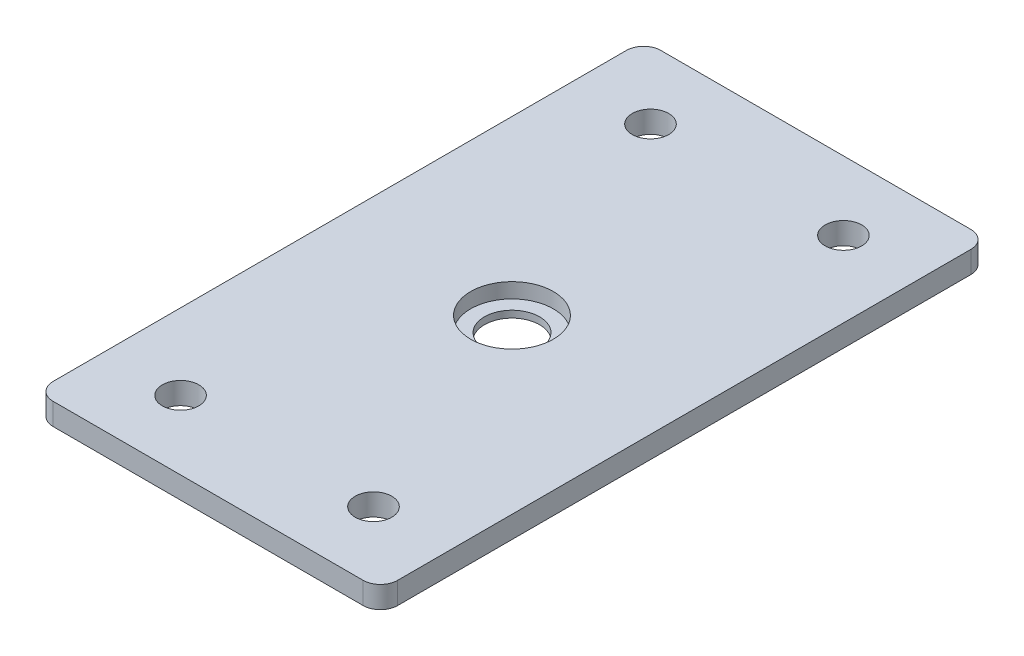
ISO-10303-21;
HEADER;
FILE_DESCRIPTION(('STEP AP214'),'2;1');
FILE_NAME('part.step','',(''),(''),'','','');
FILE_SCHEMA(('AUTOMOTIVE_DESIGN { 1 0 10303 214 1 1 1 1 }'));
ENDSEC;
DATA;
#1=APPLICATION_CONTEXT('core data for automotive mechanical design processes');
#2=APPLICATION_PROTOCOL_DEFINITION('international standard','automotive_design',2000,#1);
#3=PRODUCT_CONTEXT('',#1,'mechanical');
#4=PRODUCT('Part','Part','',(#3));
#5=PRODUCT_RELATED_PRODUCT_CATEGORY('part','',(#4));
#6=PRODUCT_DEFINITION_FORMATION('','',#4);
#7=PRODUCT_DEFINITION_CONTEXT('part definition',#1,'design');
#8=PRODUCT_DEFINITION('design','',#6,#7);
#9=PRODUCT_DEFINITION_SHAPE('','',#8);
#10=(LENGTH_UNIT() NAMED_UNIT(*) SI_UNIT(.MILLI.,.METRE.));
#11=(NAMED_UNIT(*) PLANE_ANGLE_UNIT() SI_UNIT($,.RADIAN.));
#12=(NAMED_UNIT(*) SI_UNIT($,.STERADIAN.) SOLID_ANGLE_UNIT());
#13=UNCERTAINTY_MEASURE_WITH_UNIT(LENGTH_MEASURE(1.E-05),#10,'distance_accuracy_value','');
#14=(GEOMETRIC_REPRESENTATION_CONTEXT(3) GLOBAL_UNCERTAINTY_ASSIGNED_CONTEXT((#13)) GLOBAL_UNIT_ASSIGNED_CONTEXT((#10,
#11,#12)) REPRESENTATION_CONTEXT('',''));
#15=CARTESIAN_POINT('',(0.,0.,0.));
#16=DIRECTION('',(0.,0.,1.));
#17=DIRECTION('',(1.,0.,0.));
#18=AXIS2_PLACEMENT_3D('',#15,#16,#17);
#19=CARTESIAN_POINT('',(0.,-43.85,0.));
#20=DIRECTION('',(0.,1.,0.));
#21=DIRECTION('',(0.,0.,1.));
#22=AXIS2_PLACEMENT_3D('',#19,#20,#21);
#23=CYLINDRICAL_SURFACE('',#22,4.);
#24=CARTESIAN_POINT('',(0.,-43.85,0.));
#25=DIRECTION('',(0.,1.,0.));
#26=DIRECTION('',(0.,0.,1.));
#27=AXIS2_PLACEMENT_3D('',#24,#25,#26);
#28=CIRCLE('',#27,4.);
#29=CARTESIAN_POINT('',(0.,-43.85,4.));
#30=VERTEX_POINT('',#29);
#31=EDGE_CURVE('E148',#30,#30,#28,.T.);
#32=ORIENTED_EDGE('',*,*,#31,.F.);
#33=EDGE_LOOP('',(#32));
#34=FACE_BOUND('',#33,.T.);
#35=CARTESIAN_POINT('',(0.,-42.85,0.));
#36=DIRECTION('',(0.,1.,0.));
#37=DIRECTION('',(0.,0.,1.));
#38=AXIS2_PLACEMENT_3D('',#35,#36,#37);
#39=CIRCLE('',#38,4.);
#40=CARTESIAN_POINT('',(0.,-42.85,4.));
#41=VERTEX_POINT('',#40);
#42=EDGE_CURVE('E317',#41,#41,#39,.T.);
#43=ORIENTED_EDGE('',*,*,#42,.T.);
#44=EDGE_LOOP('',(#43));
#45=FACE_BOUND('',#44,.T.);
#46=ADVANCED_FACE('F41',(#34,#45),#23,.F.);
#47=CARTESIAN_POINT('',(0.,-43.85,-44.1));
#48=DIRECTION('',(0.,0.,1.));
#49=DIRECTION('',(1.,0.,0.));
#50=AXIS2_PLACEMENT_3D('',#47,#48,#49);
#51=PLANE('',#50);
#52=DIRECTION('',(1.,0.,0.));
#53=VECTOR('',#52,1.);
#54=CARTESIAN_POINT('',(0.,-43.85,-44.1));
#55=LINE('',#54,#53);
#56=CARTESIAN_POINT('',(-22.5,-43.85,-44.1));
#57=VERTEX_POINT('',#56);
#58=CARTESIAN_POINT('',(22.5,-43.85,-44.1));
#59=VERTEX_POINT('',#58);
#60=EDGE_CURVE('E126',#57,#59,#55,.T.);
#61=ORIENTED_EDGE('',*,*,#60,.F.);
#62=DIRECTION('',(0.,1.,0.));
#63=VECTOR('',#62,1.);
#64=CARTESIAN_POINT('',(-22.5,-40.675,-44.1));
#65=LINE('',#64,#63);
#66=CARTESIAN_POINT('',(-22.5,-40.675,-44.1));
#67=VERTEX_POINT('',#66);
#68=EDGE_CURVE('E110',#57,#67,#65,.T.);
#69=ORIENTED_EDGE('',*,*,#68,.T.);
#70=DIRECTION('',(1.,0.,0.));
#71=VECTOR('',#70,1.);
#72=CARTESIAN_POINT('',(0.,-40.675,-44.1));
#73=LINE('',#72,#71);
#74=CARTESIAN_POINT('',(22.5,-40.675,-44.1));
#75=VERTEX_POINT('',#74);
#76=EDGE_CURVE('E123',#67,#75,#73,.T.);
#77=ORIENTED_EDGE('',*,*,#76,.T.);
#78=DIRECTION('',(0.,1.,0.));
#79=VECTOR('',#78,1.);
#80=CARTESIAN_POINT('',(22.5,-43.85,-44.1));
#81=LINE('',#80,#79);
#82=EDGE_CURVE('E128',#75,#59,#81,.F.);
#83=ORIENTED_EDGE('',*,*,#82,.T.);
#84=EDGE_LOOP('',(#61,#69,#77,#83));
#85=FACE_BOUND('',#84,.T.);
#86=ADVANCED_FACE('F122',(#85),#51,.F.);
#87=CARTESIAN_POINT('',(25.,-43.85,0.));
#88=DIRECTION('',(-1.,0.,0.));
#89=DIRECTION('',(0.,0.,1.));
#90=AXIS2_PLACEMENT_3D('',#87,#88,#89);
#91=PLANE('',#90);
#92=DIRECTION('',(0.,0.,1.));
#93=VECTOR('',#92,1.);
#94=CARTESIAN_POINT('',(25.,-43.85,0.));
#95=LINE('',#94,#93);
#96=CARTESIAN_POINT('',(25.,-43.85,-41.6));
#97=VERTEX_POINT('',#96);
#98=CARTESIAN_POINT('',(25.,-43.85,41.6));
#99=VERTEX_POINT('',#98);
#100=EDGE_CURVE('E183',#97,#99,#95,.T.);
#101=ORIENTED_EDGE('',*,*,#100,.F.);
#102=DIRECTION('',(0.,1.,0.));
#103=VECTOR('',#102,1.);
#104=CARTESIAN_POINT('',(25.,-43.85,-41.6));
#105=LINE('',#104,#103);
#106=CARTESIAN_POINT('',(25.,-40.675,-41.6));
#107=VERTEX_POINT('',#106);
#108=EDGE_CURVE('E166',#97,#107,#105,.T.);
#109=ORIENTED_EDGE('',*,*,#108,.T.);
#110=DIRECTION('',(0.,0.,1.));
#111=VECTOR('',#110,1.);
#112=CARTESIAN_POINT('',(25.,-40.675,0.));
#113=LINE('',#112,#111);
#114=CARTESIAN_POINT('',(25.,-40.675,41.6));
#115=VERTEX_POINT('',#114);
#116=EDGE_CURVE('E144',#107,#115,#113,.T.);
#117=ORIENTED_EDGE('',*,*,#116,.T.);
#118=DIRECTION('',(0.,1.,0.));
#119=VECTOR('',#118,1.);
#120=CARTESIAN_POINT('',(25.,-43.85,41.6));
#121=LINE('',#120,#119);
#122=EDGE_CURVE('E164',#115,#99,#121,.F.);
#123=ORIENTED_EDGE('',*,*,#122,.T.);
#124=EDGE_LOOP('',(#101,#109,#117,#123));
#125=FACE_BOUND('',#124,.T.);
#126=ADVANCED_FACE('F231',(#125),#91,.F.);
#127=CARTESIAN_POINT('',(0.,-43.85,44.1));
#128=DIRECTION('',(0.,0.,1.));
#129=DIRECTION('',(1.,0.,0.));
#130=AXIS2_PLACEMENT_3D('',#127,#128,#129);
#131=PLANE('',#130);
#132=DIRECTION('',(1.,0.,0.));
#133=VECTOR('',#132,1.);
#134=CARTESIAN_POINT('',(0.,-40.675,44.1));
#135=LINE('',#134,#133);
#136=CARTESIAN_POINT('',(-22.5,-40.675,44.1));
#137=VERTEX_POINT('',#136);
#138=CARTESIAN_POINT('',(22.5,-40.675,44.1));
#139=VERTEX_POINT('',#138);
#140=EDGE_CURVE('E135',#137,#139,#135,.T.);
#141=ORIENTED_EDGE('',*,*,#140,.F.);
#142=DIRECTION('',(0.,1.,0.));
#143=VECTOR('',#142,1.);
#144=CARTESIAN_POINT('',(-22.5,-43.85,44.1));
#145=LINE('',#144,#143);
#146=CARTESIAN_POINT('',(-22.5,-43.85,44.1));
#147=VERTEX_POINT('',#146);
#148=EDGE_CURVE('E11',#137,#147,#145,.F.);
#149=ORIENTED_EDGE('',*,*,#148,.T.);
#150=DIRECTION('',(1.,0.,0.));
#151=VECTOR('',#150,1.);
#152=CARTESIAN_POINT('',(0.,-43.85,44.1));
#153=LINE('',#152,#151);
#154=CARTESIAN_POINT('',(22.5,-43.85,44.1));
#155=VERTEX_POINT('',#154);
#156=EDGE_CURVE('E171',#147,#155,#153,.T.);
#157=ORIENTED_EDGE('',*,*,#156,.T.);
#158=DIRECTION('',(0.,1.,0.));
#159=VECTOR('',#158,1.);
#160=CARTESIAN_POINT('',(22.5,-40.675,44.1));
#161=LINE('',#160,#159);
#162=EDGE_CURVE('E49',#155,#139,#161,.T.);
#163=ORIENTED_EDGE('',*,*,#162,.T.);
#164=EDGE_LOOP('',(#141,#149,#157,#163));
#165=FACE_BOUND('',#164,.T.);
#166=ADVANCED_FACE('F170',(#165),#131,.T.);
#167=CARTESIAN_POINT('',(-25.,-43.85,0.));
#168=DIRECTION('',(-1.,0.,0.));
#169=DIRECTION('',(0.,0.,1.));
#170=AXIS2_PLACEMENT_3D('',#167,#168,#169);
#171=PLANE('',#170);
#172=DIRECTION('',(0.,0.,1.));
#173=VECTOR('',#172,1.);
#174=CARTESIAN_POINT('',(-25.,-40.675,0.));
#175=LINE('',#174,#173);
#176=CARTESIAN_POINT('',(-25.,-40.675,-41.6));
#177=VERTEX_POINT('',#176);
#178=CARTESIAN_POINT('',(-25.,-40.675,41.6));
#179=VERTEX_POINT('',#178);
#180=EDGE_CURVE('E132',#177,#179,#175,.T.);
#181=ORIENTED_EDGE('',*,*,#180,.F.);
#182=DIRECTION('',(0.,1.,0.));
#183=VECTOR('',#182,1.);
#184=CARTESIAN_POINT('',(-25.,-43.85,-41.6));
#185=LINE('',#184,#183);
#186=CARTESIAN_POINT('',(-25.,-43.85,-41.6));
#187=VERTEX_POINT('',#186);
#188=EDGE_CURVE('E111',#177,#187,#185,.F.);
#189=ORIENTED_EDGE('',*,*,#188,.T.);
#190=DIRECTION('',(0.,0.,1.));
#191=VECTOR('',#190,1.);
#192=CARTESIAN_POINT('',(-25.,-43.85,0.));
#193=LINE('',#192,#191);
#194=CARTESIAN_POINT('',(-25.,-43.85,41.6));
#195=VERTEX_POINT('',#194);
#196=EDGE_CURVE('E181',#187,#195,#193,.T.);
#197=ORIENTED_EDGE('',*,*,#196,.T.);
#198=DIRECTION('',(0.,1.,0.));
#199=VECTOR('',#198,1.);
#200=CARTESIAN_POINT('',(-25.,-43.85,41.6));
#201=LINE('',#200,#199);
#202=EDGE_CURVE('E116',#195,#179,#201,.T.);
#203=ORIENTED_EDGE('',*,*,#202,.T.);
#204=EDGE_LOOP('',(#181,#189,#197,#203));
#205=FACE_BOUND('',#204,.T.);
#206=ADVANCED_FACE('F179',(#205),#171,.T.);
#207=CARTESIAN_POINT('',(-14.,-43.85,-34.1));
#208=DIRECTION('',(0.,1.,0.));
#209=DIRECTION('',(0.,0.,1.));
#210=AXIS2_PLACEMENT_3D('',#207,#208,#209);
#211=CYLINDRICAL_SURFACE('',#210,2.65);
#212=CARTESIAN_POINT('',(-14.,-43.85,-34.1));
#213=DIRECTION('',(0.,1.,0.));
#214=DIRECTION('',(0.,0.,1.));
#215=AXIS2_PLACEMENT_3D('',#212,#213,#214);
#216=CIRCLE('',#215,2.65);
#217=CARTESIAN_POINT('',(-14.,-43.85,-31.45));
#218=VERTEX_POINT('',#217);
#219=EDGE_CURVE('E185',#218,#218,#216,.T.);
#220=ORIENTED_EDGE('',*,*,#219,.F.);
#221=EDGE_LOOP('',(#220));
#222=FACE_BOUND('',#221,.T.);
#223=CARTESIAN_POINT('',(-14.,-40.675,-34.1));
#224=DIRECTION('',(0.,1.,0.));
#225=DIRECTION('',(0.,0.,1.));
#226=AXIS2_PLACEMENT_3D('',#223,#224,#225);
#227=CIRCLE('',#226,2.65);
#228=CARTESIAN_POINT('',(-14.,-40.675,-31.45));
#229=VERTEX_POINT('',#228);
#230=EDGE_CURVE('E133',#229,#229,#227,.T.);
#231=ORIENTED_EDGE('',*,*,#230,.T.);
#232=EDGE_LOOP('',(#231));
#233=FACE_BOUND('',#232,.T.);
#234=ADVANCED_FACE('F210',(#222,#233),#211,.F.);
#235=CARTESIAN_POINT('',(14.,-43.85,-34.1));
#236=DIRECTION('',(0.,1.,0.));
#237=DIRECTION('',(0.,0.,1.));
#238=AXIS2_PLACEMENT_3D('',#235,#236,#237);
#239=CYLINDRICAL_SURFACE('',#238,2.65);
#240=CARTESIAN_POINT('',(14.,-43.85,-34.1));
#241=DIRECTION('',(0.,1.,0.));
#242=DIRECTION('',(0.,0.,1.));
#243=AXIS2_PLACEMENT_3D('',#240,#241,#242);
#244=CIRCLE('',#243,2.65);
#245=CARTESIAN_POINT('',(14.,-43.85,-31.45));
#246=VERTEX_POINT('',#245);
#247=EDGE_CURVE('E331',#246,#246,#244,.T.);
#248=ORIENTED_EDGE('',*,*,#247,.F.);
#249=EDGE_LOOP('',(#248));
#250=FACE_BOUND('',#249,.T.);
#251=CARTESIAN_POINT('',(14.,-40.675,-34.1));
#252=DIRECTION('',(0.,1.,0.));
#253=DIRECTION('',(0.,0.,1.));
#254=AXIS2_PLACEMENT_3D('',#251,#252,#253);
#255=CIRCLE('',#254,2.65);
#256=CARTESIAN_POINT('',(14.,-40.675,-31.45));
#257=VERTEX_POINT('',#256);
#258=EDGE_CURVE('E138',#257,#257,#255,.T.);
#259=ORIENTED_EDGE('',*,*,#258,.T.);
#260=EDGE_LOOP('',(#259));
#261=FACE_BOUND('',#260,.T.);
#262=ADVANCED_FACE('F201',(#250,#261),#239,.F.);
#263=CARTESIAN_POINT('',(14.,-43.85,34.1));
#264=DIRECTION('',(0.,1.,0.));
#265=DIRECTION('',(0.,0.,1.));
#266=AXIS2_PLACEMENT_3D('',#263,#264,#265);
#267=CYLINDRICAL_SURFACE('',#266,2.65);
#268=CARTESIAN_POINT('',(14.,-43.85,34.1));
#269=DIRECTION('',(0.,1.,0.));
#270=DIRECTION('',(0.,0.,1.));
#271=AXIS2_PLACEMENT_3D('',#268,#269,#270);
#272=CIRCLE('',#271,2.65);
#273=CARTESIAN_POINT('',(14.,-43.85,36.75));
#274=VERTEX_POINT('',#273);
#275=EDGE_CURVE('E328',#274,#274,#272,.T.);
#276=ORIENTED_EDGE('',*,*,#275,.F.);
#277=EDGE_LOOP('',(#276));
#278=FACE_BOUND('',#277,.T.);
#279=CARTESIAN_POINT('',(14.,-40.675,34.1));
#280=DIRECTION('',(0.,1.,0.));
#281=DIRECTION('',(0.,0.,1.));
#282=AXIS2_PLACEMENT_3D('',#279,#280,#281);
#283=CIRCLE('',#282,2.65);
#284=CARTESIAN_POINT('',(14.,-40.675,36.75));
#285=VERTEX_POINT('',#284);
#286=EDGE_CURVE('E195',#285,#285,#283,.T.);
#287=ORIENTED_EDGE('',*,*,#286,.T.);
#288=EDGE_LOOP('',(#287));
#289=FACE_BOUND('',#288,.T.);
#290=ADVANCED_FACE('F217',(#278,#289),#267,.F.);
#291=CARTESIAN_POINT('',(-14.,-43.85,34.1));
#292=DIRECTION('',(0.,1.,0.));
#293=DIRECTION('',(0.,0.,1.));
#294=AXIS2_PLACEMENT_3D('',#291,#292,#293);
#295=CYLINDRICAL_SURFACE('',#294,2.65);
#296=CARTESIAN_POINT('',(-14.,-43.85,34.1));
#297=DIRECTION('',(0.,1.,0.));
#298=DIRECTION('',(0.,0.,1.));
#299=AXIS2_PLACEMENT_3D('',#296,#297,#298);
#300=CIRCLE('',#299,2.65);
#301=CARTESIAN_POINT('',(-14.,-43.85,36.75));
#302=VERTEX_POINT('',#301);
#303=EDGE_CURVE('E147',#302,#302,#300,.T.);
#304=ORIENTED_EDGE('',*,*,#303,.F.);
#305=EDGE_LOOP('',(#304));
#306=FACE_BOUND('',#305,.T.);
#307=CARTESIAN_POINT('',(-14.,-40.675,34.1));
#308=DIRECTION('',(0.,1.,0.));
#309=DIRECTION('',(0.,0.,1.));
#310=AXIS2_PLACEMENT_3D('',#307,#308,#309);
#311=CIRCLE('',#310,2.65);
#312=CARTESIAN_POINT('',(-14.,-40.675,36.75));
#313=VERTEX_POINT('',#312);
#314=EDGE_CURVE('E192',#313,#313,#311,.T.);
#315=ORIENTED_EDGE('',*,*,#314,.T.);
#316=EDGE_LOOP('',(#315));
#317=FACE_BOUND('',#316,.T.);
#318=ADVANCED_FACE('F256',(#306,#317),#295,.F.);
#319=CARTESIAN_POINT('',(0.,-43.85,0.));
#320=DIRECTION('',(0.,1.,0.));
#321=DIRECTION('',(0.,0.,1.));
#322=AXIS2_PLACEMENT_3D('',#319,#320,#321);
#323=PLANE('',#322);
#324=ORIENTED_EDGE('',*,*,#303,.T.);
#325=EDGE_LOOP('',(#324));
#326=FACE_BOUND('',#325,.T.);
#327=ORIENTED_EDGE('',*,*,#275,.T.);
#328=EDGE_LOOP('',(#327));
#329=FACE_BOUND('',#328,.T.);
#330=ORIENTED_EDGE('',*,*,#247,.T.);
#331=EDGE_LOOP('',(#330));
#332=FACE_BOUND('',#331,.T.);
#333=ORIENTED_EDGE('',*,*,#219,.T.);
#334=EDGE_LOOP('',(#333));
#335=FACE_BOUND('',#334,.T.);
#336=ORIENTED_EDGE('',*,*,#196,.F.);
#337=CARTESIAN_POINT('',(-22.5,-43.85,-41.6));
#338=DIRECTION('',(0.,1.,0.));
#339=DIRECTION('',(0.,0.,1.));
#340=AXIS2_PLACEMENT_3D('',#337,#338,#339);
#341=CIRCLE('',#340,2.5);
#342=EDGE_CURVE('E162',#187,#57,#341,.F.);
#343=ORIENTED_EDGE('',*,*,#342,.T.);
#344=ORIENTED_EDGE('',*,*,#60,.T.);
#345=CARTESIAN_POINT('',(22.5,-43.85,-41.6));
#346=DIRECTION('',(0.,1.,0.));
#347=DIRECTION('',(0.,0.,1.));
#348=AXIS2_PLACEMENT_3D('',#345,#346,#347);
#349=CIRCLE('',#348,2.5);
#350=EDGE_CURVE('E160',#59,#97,#349,.F.);
#351=ORIENTED_EDGE('',*,*,#350,.T.);
#352=ORIENTED_EDGE('',*,*,#100,.T.);
#353=CARTESIAN_POINT('',(22.5,-43.85,41.6));
#354=DIRECTION('',(0.,1.,0.));
#355=DIRECTION('',(0.,0.,1.));
#356=AXIS2_PLACEMENT_3D('',#353,#354,#355);
#357=CIRCLE('',#356,2.5);
#358=EDGE_CURVE('E56',#99,#155,#357,.F.);
#359=ORIENTED_EDGE('',*,*,#358,.T.);
#360=ORIENTED_EDGE('',*,*,#156,.F.);
#361=CARTESIAN_POINT('',(-22.5,-43.85,41.6));
#362=DIRECTION('',(0.,1.,0.));
#363=DIRECTION('',(0.,0.,1.));
#364=AXIS2_PLACEMENT_3D('',#361,#362,#363);
#365=CIRCLE('',#364,2.5);
#366=EDGE_CURVE('E158',#147,#195,#365,.F.);
#367=ORIENTED_EDGE('',*,*,#366,.T.);
#368=EDGE_LOOP('',(#336,#343,#344,#351,#352,#359,#360,#367));
#369=FACE_BOUND('',#368,.T.);
#370=ORIENTED_EDGE('',*,*,#31,.T.);
#371=EDGE_LOOP('',(#370));
#372=FACE_BOUND('',#371,.T.);
#373=ADVANCED_FACE('F205',(#326,#329,#332,#335,#369,#372),#323,.F.);
#374=CARTESIAN_POINT('',(0.,-40.675,0.));
#375=DIRECTION('',(0.,1.,0.));
#376=DIRECTION('',(0.,0.,1.));
#377=AXIS2_PLACEMENT_3D('',#374,#375,#376);
#378=PLANE('',#377);
#379=CARTESIAN_POINT('',(0.,-40.675,0.));
#380=DIRECTION('',(0.,1.,0.));
#381=DIRECTION('',(0.,0.,1.));
#382=AXIS2_PLACEMENT_3D('',#379,#380,#381);
#383=CIRCLE('',#382,6.);
#384=CARTESIAN_POINT('',(0.,-40.675,6.));
#385=VERTEX_POINT('',#384);
#386=EDGE_CURVE('E321',#385,#385,#383,.T.);
#387=ORIENTED_EDGE('',*,*,#386,.F.);
#388=EDGE_LOOP('',(#387));
#389=FACE_BOUND('',#388,.T.);
#390=ORIENTED_EDGE('',*,*,#314,.F.);
#391=EDGE_LOOP('',(#390));
#392=FACE_BOUND('',#391,.T.);
#393=ORIENTED_EDGE('',*,*,#286,.F.);
#394=EDGE_LOOP('',(#393));
#395=FACE_BOUND('',#394,.T.);
#396=ORIENTED_EDGE('',*,*,#258,.F.);
#397=EDGE_LOOP('',(#396));
#398=FACE_BOUND('',#397,.T.);
#399=ORIENTED_EDGE('',*,*,#230,.F.);
#400=EDGE_LOOP('',(#399));
#401=FACE_BOUND('',#400,.T.);
#402=ORIENTED_EDGE('',*,*,#76,.F.);
#403=CARTESIAN_POINT('',(-22.5,-40.675,-41.6));
#404=DIRECTION('',(0.,1.,0.));
#405=DIRECTION('',(0.,0.,1.));
#406=AXIS2_PLACEMENT_3D('',#403,#404,#405);
#407=CIRCLE('',#406,2.5);
#408=EDGE_CURVE('E106',#67,#177,#407,.T.);
#409=ORIENTED_EDGE('',*,*,#408,.T.);
#410=ORIENTED_EDGE('',*,*,#180,.T.);
#411=CARTESIAN_POINT('',(-22.5,-40.675,41.6));
#412=DIRECTION('',(0.,1.,0.));
#413=DIRECTION('',(0.,0.,1.));
#414=AXIS2_PLACEMENT_3D('',#411,#412,#413);
#415=CIRCLE('',#414,2.5);
#416=EDGE_CURVE('E151',#179,#137,#415,.T.);
#417=ORIENTED_EDGE('',*,*,#416,.T.);
#418=ORIENTED_EDGE('',*,*,#140,.T.);
#419=CARTESIAN_POINT('',(22.5,-40.675,41.6));
#420=DIRECTION('',(0.,1.,0.));
#421=DIRECTION('',(0.,0.,1.));
#422=AXIS2_PLACEMENT_3D('',#419,#420,#421);
#423=CIRCLE('',#422,2.5);
#424=EDGE_CURVE('E127',#139,#115,#423,.T.);
#425=ORIENTED_EDGE('',*,*,#424,.T.);
#426=ORIENTED_EDGE('',*,*,#116,.F.);
#427=CARTESIAN_POINT('',(22.5,-40.675,-41.6));
#428=DIRECTION('',(0.,1.,0.));
#429=DIRECTION('',(0.,0.,1.));
#430=AXIS2_PLACEMENT_3D('',#427,#428,#429);
#431=CIRCLE('',#430,2.5);
#432=EDGE_CURVE('E117',#107,#75,#431,.T.);
#433=ORIENTED_EDGE('',*,*,#432,.T.);
#434=EDGE_LOOP('',(#402,#409,#410,#417,#418,#425,#426,#433));
#435=FACE_BOUND('',#434,.T.);
#436=ADVANCED_FACE('F130',(#389,#392,#395,#398,#401,#435),#378,.T.);
#437=CARTESIAN_POINT('',(-22.5,-43.85,-41.6));
#438=DIRECTION('',(0.,-1.,0.));
#439=DIRECTION('',(0.,0.,-1.));
#440=AXIS2_PLACEMENT_3D('',#437,#438,#439);
#441=CYLINDRICAL_SURFACE('',#440,2.5);
#442=ORIENTED_EDGE('',*,*,#342,.F.);
#443=ORIENTED_EDGE('',*,*,#188,.F.);
#444=ORIENTED_EDGE('',*,*,#408,.F.);
#445=ORIENTED_EDGE('',*,*,#68,.F.);
#446=EDGE_LOOP('',(#442,#443,#444,#445));
#447=FACE_BOUND('',#446,.T.);
#448=ADVANCED_FACE('F109',(#447),#441,.T.);
#449=CARTESIAN_POINT('',(22.5,-43.85,-41.6));
#450=DIRECTION('',(0.,1.,0.));
#451=DIRECTION('',(0.,0.,1.));
#452=AXIS2_PLACEMENT_3D('',#449,#450,#451);
#453=CYLINDRICAL_SURFACE('',#452,2.5);
#454=ORIENTED_EDGE('',*,*,#350,.F.);
#455=ORIENTED_EDGE('',*,*,#82,.F.);
#456=ORIENTED_EDGE('',*,*,#432,.F.);
#457=ORIENTED_EDGE('',*,*,#108,.F.);
#458=EDGE_LOOP('',(#454,#455,#456,#457));
#459=FACE_BOUND('',#458,.T.);
#460=ADVANCED_FACE('F265',(#459),#453,.T.);
#461=CARTESIAN_POINT('',(-22.5,-43.85,41.6));
#462=DIRECTION('',(0.,1.,0.));
#463=DIRECTION('',(0.,0.,1.));
#464=AXIS2_PLACEMENT_3D('',#461,#462,#463);
#465=CYLINDRICAL_SURFACE('',#464,2.5);
#466=ORIENTED_EDGE('',*,*,#366,.F.);
#467=ORIENTED_EDGE('',*,*,#148,.F.);
#468=ORIENTED_EDGE('',*,*,#416,.F.);
#469=ORIENTED_EDGE('',*,*,#202,.F.);
#470=EDGE_LOOP('',(#466,#467,#468,#469));
#471=FACE_BOUND('',#470,.T.);
#472=ADVANCED_FACE('F176',(#471),#465,.T.);
#473=CARTESIAN_POINT('',(22.5,-43.85,41.6));
#474=DIRECTION('',(0.,-1.,0.));
#475=DIRECTION('',(0.,0.,-1.));
#476=AXIS2_PLACEMENT_3D('',#473,#474,#475);
#477=CYLINDRICAL_SURFACE('',#476,2.5);
#478=ORIENTED_EDGE('',*,*,#358,.F.);
#479=ORIENTED_EDGE('',*,*,#122,.F.);
#480=ORIENTED_EDGE('',*,*,#424,.F.);
#481=ORIENTED_EDGE('',*,*,#162,.F.);
#482=EDGE_LOOP('',(#478,#479,#480,#481));
#483=FACE_BOUND('',#482,.T.);
#484=ADVANCED_FACE('F43',(#483),#477,.T.);
#485=CARTESIAN_POINT('',(0.,-42.85,0.));
#486=DIRECTION('',(0.,1.,0.));
#487=DIRECTION('',(0.,0.,1.));
#488=AXIS2_PLACEMENT_3D('',#485,#486,#487);
#489=CYLINDRICAL_SURFACE('',#488,6.);
#490=CARTESIAN_POINT('',(0.,-42.85,0.));
#491=DIRECTION('',(0.,1.,0.));
#492=DIRECTION('',(0.,0.,1.));
#493=AXIS2_PLACEMENT_3D('',#490,#491,#492);
#494=CIRCLE('',#493,6.);
#495=CARTESIAN_POINT('',(0.,-42.85,6.));
#496=VERTEX_POINT('',#495);
#497=EDGE_CURVE('E196',#496,#496,#494,.T.);
#498=ORIENTED_EDGE('',*,*,#497,.F.);
#499=EDGE_LOOP('',(#498));
#500=FACE_BOUND('',#499,.T.);
#501=ORIENTED_EDGE('',*,*,#386,.T.);
#502=EDGE_LOOP('',(#501));
#503=FACE_BOUND('',#502,.T.);
#504=ADVANCED_FACE('F286',(#500,#503),#489,.F.);
#505=CARTESIAN_POINT('',(0.,-42.85,0.));
#506=DIRECTION('',(0.,1.,0.));
#507=DIRECTION('',(0.,0.,1.));
#508=AXIS2_PLACEMENT_3D('',#505,#506,#507);
#509=PLANE('',#508);
#510=ORIENTED_EDGE('',*,*,#42,.F.);
#511=EDGE_LOOP('',(#510));
#512=FACE_BOUND('',#511,.T.);
#513=ORIENTED_EDGE('',*,*,#497,.T.);
#514=EDGE_LOOP('',(#513));
#515=FACE_BOUND('',#514,.T.);
#516=ADVANCED_FACE('F301',(#512,#515),#509,.T.);
#517=CLOSED_SHELL('',(#46,#86,#126,#166,#206,#234,#262,#290,#318,#373,#436,#448,#460,#472,#484,
#504,#516));
#518=MANIFOLD_SOLID_BREP('B2',#517);
#519=ADVANCED_BREP_SHAPE_REPRESENTATION('',(#18,#518),#14);
#520=SHAPE_DEFINITION_REPRESENTATION(#9,#519);
ENDSEC;
END-ISO-10303-21;
